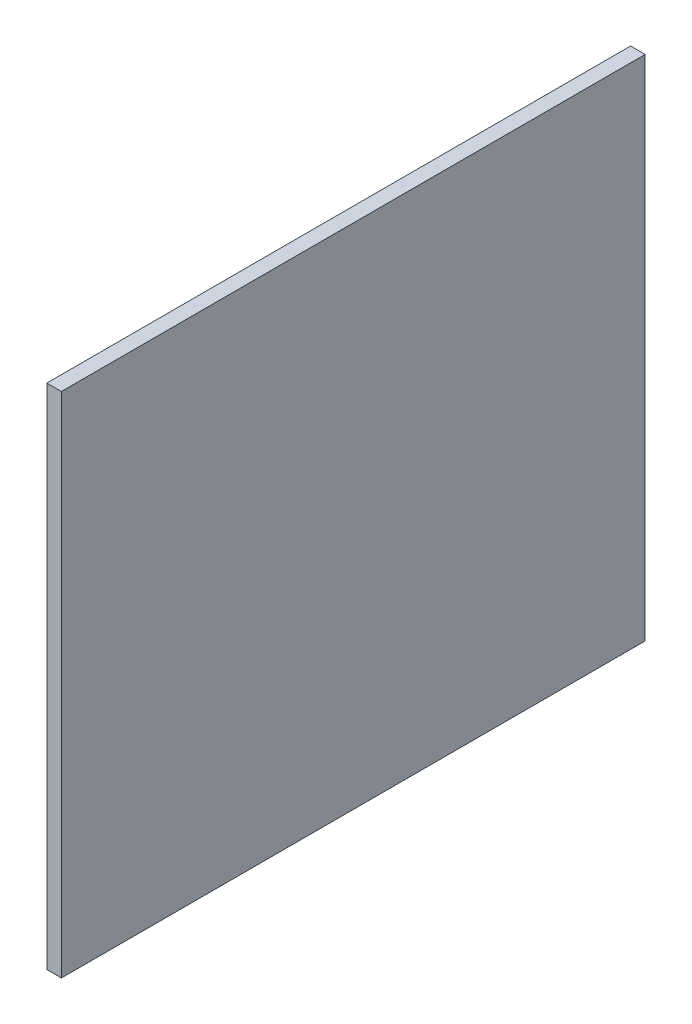
ISO-10303-21;
HEADER;
FILE_DESCRIPTION(('STEP AP214'),'2;1');
FILE_NAME('part.step','',(''),(''),'','','');
FILE_SCHEMA(('AUTOMOTIVE_DESIGN { 1 0 10303 214 1 1 1 1 }'));
ENDSEC;
DATA;
#1=APPLICATION_CONTEXT('core data for automotive mechanical design processes');
#2=APPLICATION_PROTOCOL_DEFINITION('international standard','automotive_design',2000,#1);
#3=PRODUCT_CONTEXT('',#1,'mechanical');
#4=PRODUCT('Part','Part','',(#3));
#5=PRODUCT_RELATED_PRODUCT_CATEGORY('part','',(#4));
#6=PRODUCT_DEFINITION_FORMATION('','',#4);
#7=PRODUCT_DEFINITION_CONTEXT('part definition',#1,'design');
#8=PRODUCT_DEFINITION('design','',#6,#7);
#9=PRODUCT_DEFINITION_SHAPE('','',#8);
#10=(LENGTH_UNIT() NAMED_UNIT(*) SI_UNIT(.MILLI.,.METRE.));
#11=(NAMED_UNIT(*) PLANE_ANGLE_UNIT() SI_UNIT($,.RADIAN.));
#12=(NAMED_UNIT(*) SI_UNIT($,.STERADIAN.) SOLID_ANGLE_UNIT());
#13=UNCERTAINTY_MEASURE_WITH_UNIT(LENGTH_MEASURE(1.E-05),#10,'distance_accuracy_value','');
#14=(GEOMETRIC_REPRESENTATION_CONTEXT(3) GLOBAL_UNCERTAINTY_ASSIGNED_CONTEXT((#13)) GLOBAL_UNIT_ASSIGNED_CONTEXT((#10,
#11,#12)) REPRESENTATION_CONTEXT('',''));
#15=CARTESIAN_POINT('',(0.,0.,0.));
#16=DIRECTION('',(0.,0.,1.));
#17=DIRECTION('',(1.,0.,0.));
#18=AXIS2_PLACEMENT_3D('',#15,#16,#17);
#19=CARTESIAN_POINT('',(25.,0.,0.));
#20=DIRECTION('',(0.,0.,-1.));
#21=DIRECTION('',(-1.,0.,0.));
#22=AXIS2_PLACEMENT_3D('',#19,#20,#21);
#23=PLANE('',#22);
#24=DIRECTION('',(0.,-1.,0.));
#25=VECTOR('',#24,1.);
#26=CARTESIAN_POINT('',(0.,0.,0.));
#27=LINE('',#26,#25);
#28=CARTESIAN_POINT('',(0.,870.,0.));
#29=VERTEX_POINT('',#28);
#30=CARTESIAN_POINT('',(0.,0.,0.));
#31=VERTEX_POINT('',#30);
#32=EDGE_CURVE('E96',#29,#31,#27,.T.);
#33=ORIENTED_EDGE('',*,*,#32,.T.);
#34=DIRECTION('',(-1.,0.,0.));
#35=VECTOR('',#34,1.);
#36=CARTESIAN_POINT('',(25.,0.,0.));
#37=LINE('',#36,#35);
#38=CARTESIAN_POINT('',(25.,0.,0.));
#39=VERTEX_POINT('',#38);
#40=EDGE_CURVE('E11',#39,#31,#37,.T.);
#41=ORIENTED_EDGE('',*,*,#40,.F.);
#42=DIRECTION('',(0.,-1.,0.));
#43=VECTOR('',#42,1.);
#44=CARTESIAN_POINT('',(25.,0.,0.));
#45=LINE('',#44,#43);
#46=CARTESIAN_POINT('',(25.,870.,0.));
#47=VERTEX_POINT('',#46);
#48=EDGE_CURVE('E84',#47,#39,#45,.T.);
#49=ORIENTED_EDGE('',*,*,#48,.F.);
#50=DIRECTION('',(-1.,0.,0.));
#51=VECTOR('',#50,1.);
#52=CARTESIAN_POINT('',(25.,870.,0.));
#53=LINE('',#52,#51);
#54=EDGE_CURVE('E92',#47,#29,#53,.T.);
#55=ORIENTED_EDGE('',*,*,#54,.T.);
#56=EDGE_LOOP('',(#33,#41,#49,#55));
#57=FACE_BOUND('',#56,.T.);
#58=ADVANCED_FACE('F33',(#57),#23,.F.);
#59=CARTESIAN_POINT('',(25.,0.,0.));
#60=DIRECTION('',(0.,1.,0.));
#61=DIRECTION('',(0.,0.,1.));
#62=AXIS2_PLACEMENT_3D('',#59,#60,#61);
#63=PLANE('',#62);
#64=DIRECTION('',(0.,0.,-1.));
#65=VECTOR('',#64,1.);
#66=CARTESIAN_POINT('',(0.,0.,0.));
#67=LINE('',#66,#65);
#68=CARTESIAN_POINT('',(0.,0.,-1000.));
#69=VERTEX_POINT('',#68);
#70=EDGE_CURVE('E88',#31,#69,#67,.T.);
#71=ORIENTED_EDGE('',*,*,#70,.T.);
#72=DIRECTION('',(-1.,0.,0.));
#73=VECTOR('',#72,1.);
#74=CARTESIAN_POINT('',(25.,0.,-1000.));
#75=LINE('',#74,#73);
#76=CARTESIAN_POINT('',(25.,0.,-1000.));
#77=VERTEX_POINT('',#76);
#78=EDGE_CURVE('E41',#77,#69,#75,.T.);
#79=ORIENTED_EDGE('',*,*,#78,.F.);
#80=DIRECTION('',(0.,0.,-1.));
#81=VECTOR('',#80,1.);
#82=CARTESIAN_POINT('',(25.,0.,0.));
#83=LINE('',#82,#81);
#84=EDGE_CURVE('E79',#39,#77,#83,.T.);
#85=ORIENTED_EDGE('',*,*,#84,.F.);
#86=ORIENTED_EDGE('',*,*,#40,.T.);
#87=EDGE_LOOP('',(#71,#79,#85,#86));
#88=FACE_BOUND('',#87,.T.);
#89=ADVANCED_FACE('F87',(#88),#63,.F.);
#90=CARTESIAN_POINT('',(25.,0.,-1000.));
#91=DIRECTION('',(0.,0.,1.));
#92=DIRECTION('',(1.,0.,0.));
#93=AXIS2_PLACEMENT_3D('',#90,#91,#92);
#94=PLANE('',#93);
#95=DIRECTION('',(0.,1.,0.));
#96=VECTOR('',#95,1.);
#97=CARTESIAN_POINT('',(0.,0.,-1000.));
#98=LINE('',#97,#96);
#99=CARTESIAN_POINT('',(0.,870.,-1000.));
#100=VERTEX_POINT('',#99);
#101=EDGE_CURVE('E66',#69,#100,#98,.T.);
#102=ORIENTED_EDGE('',*,*,#101,.T.);
#103=DIRECTION('',(-1.,0.,0.));
#104=VECTOR('',#103,1.);
#105=CARTESIAN_POINT('',(25.,870.,-1000.));
#106=LINE('',#105,#104);
#107=CARTESIAN_POINT('',(25.,870.,-1000.));
#108=VERTEX_POINT('',#107);
#109=EDGE_CURVE('E89',#108,#100,#106,.T.);
#110=ORIENTED_EDGE('',*,*,#109,.F.);
#111=DIRECTION('',(0.,1.,0.));
#112=VECTOR('',#111,1.);
#113=CARTESIAN_POINT('',(25.,0.,-1000.));
#114=LINE('',#113,#112);
#115=EDGE_CURVE('E82',#77,#108,#114,.T.);
#116=ORIENTED_EDGE('',*,*,#115,.F.);
#117=ORIENTED_EDGE('',*,*,#78,.T.);
#118=EDGE_LOOP('',(#102,#110,#116,#117));
#119=FACE_BOUND('',#118,.T.);
#120=ADVANCED_FACE('F90',(#119),#94,.F.);
#121=CARTESIAN_POINT('',(25.,870.,0.));
#122=DIRECTION('',(0.,-1.,0.));
#123=DIRECTION('',(0.,0.,-1.));
#124=AXIS2_PLACEMENT_3D('',#121,#122,#123);
#125=PLANE('',#124);
#126=DIRECTION('',(0.,0.,1.));
#127=VECTOR('',#126,1.);
#128=CARTESIAN_POINT('',(0.,870.,0.));
#129=LINE('',#128,#127);
#130=EDGE_CURVE('E72',#100,#29,#129,.T.);
#131=ORIENTED_EDGE('',*,*,#130,.T.);
#132=ORIENTED_EDGE('',*,*,#54,.F.);
#133=DIRECTION('',(0.,0.,1.));
#134=VECTOR('',#133,1.);
#135=CARTESIAN_POINT('',(25.,870.,0.));
#136=LINE('',#135,#134);
#137=EDGE_CURVE('E49',#108,#47,#136,.T.);
#138=ORIENTED_EDGE('',*,*,#137,.F.);
#139=ORIENTED_EDGE('',*,*,#109,.T.);
#140=EDGE_LOOP('',(#131,#132,#138,#139));
#141=FACE_BOUND('',#140,.T.);
#142=ADVANCED_FACE('F103',(#141),#125,.F.);
#143=CARTESIAN_POINT('',(25.,0.,0.));
#144=DIRECTION('',(-1.,0.,0.));
#145=DIRECTION('',(0.,0.,1.));
#146=AXIS2_PLACEMENT_3D('',#143,#144,#145);
#147=PLANE('',#146);
#148=ORIENTED_EDGE('',*,*,#48,.T.);
#149=ORIENTED_EDGE('',*,*,#84,.T.);
#150=ORIENTED_EDGE('',*,*,#115,.T.);
#151=ORIENTED_EDGE('',*,*,#137,.T.);
#152=EDGE_LOOP('',(#148,#149,#150,#151));
#153=FACE_BOUND('',#152,.T.);
#154=ADVANCED_FACE('F80',(#153),#147,.F.);
#155=CARTESIAN_POINT('',(0.,0.,0.));
#156=DIRECTION('',(-1.,0.,0.));
#157=DIRECTION('',(0.,0.,1.));
#158=AXIS2_PLACEMENT_3D('',#155,#156,#157);
#159=PLANE('',#158);
#160=ORIENTED_EDGE('',*,*,#32,.F.);
#161=ORIENTED_EDGE('',*,*,#130,.F.);
#162=ORIENTED_EDGE('',*,*,#101,.F.);
#163=ORIENTED_EDGE('',*,*,#70,.F.);
#164=EDGE_LOOP('',(#160,#161,#162,#163));
#165=FACE_BOUND('',#164,.T.);
#166=ADVANCED_FACE('F106',(#165),#159,.T.);
#167=CLOSED_SHELL('',(#58,#89,#120,#142,#154,#166));
#168=MANIFOLD_SOLID_BREP('B2',#167);
#169=ADVANCED_BREP_SHAPE_REPRESENTATION('',(#18,#168),#14);
#170=SHAPE_DEFINITION_REPRESENTATION(#9,#169);
ENDSEC;
END-ISO-10303-21;
